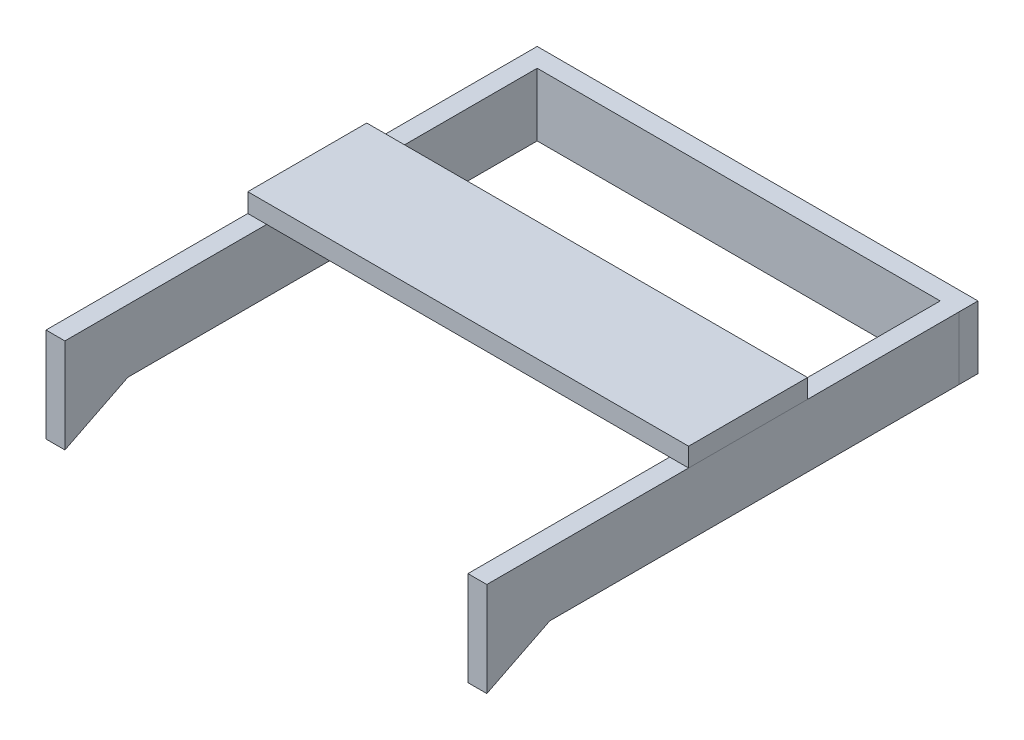
ISO-10303-21;
HEADER;
FILE_DESCRIPTION(('STEP AP214'),'2;1');
FILE_NAME('part.step','',(''),(''),'','','');
FILE_SCHEMA(('AUTOMOTIVE_DESIGN { 1 0 10303 214 1 1 1 1 }'));
ENDSEC;
DATA;
#1=APPLICATION_CONTEXT('core data for automotive mechanical design processes');
#2=APPLICATION_PROTOCOL_DEFINITION('international standard','automotive_design',2000,#1);
#3=PRODUCT_CONTEXT('',#1,'mechanical');
#4=PRODUCT('Part','Part','',(#3));
#5=PRODUCT_RELATED_PRODUCT_CATEGORY('part','',(#4));
#6=PRODUCT_DEFINITION_FORMATION('','',#4);
#7=PRODUCT_DEFINITION_CONTEXT('part definition',#1,'design');
#8=PRODUCT_DEFINITION('design','',#6,#7);
#9=PRODUCT_DEFINITION_SHAPE('','',#8);
#10=(LENGTH_UNIT() NAMED_UNIT(*) SI_UNIT(.MILLI.,.METRE.));
#11=(NAMED_UNIT(*) PLANE_ANGLE_UNIT() SI_UNIT($,.RADIAN.));
#12=(NAMED_UNIT(*) SI_UNIT($,.STERADIAN.) SOLID_ANGLE_UNIT());
#13=UNCERTAINTY_MEASURE_WITH_UNIT(LENGTH_MEASURE(1.E-05),#10,'distance_accuracy_value','');
#14=(GEOMETRIC_REPRESENTATION_CONTEXT(3) GLOBAL_UNCERTAINTY_ASSIGNED_CONTEXT((#13)) GLOBAL_UNIT_ASSIGNED_CONTEXT((#10,
#11,#12)) REPRESENTATION_CONTEXT('',''));
#15=CARTESIAN_POINT('',(0.,0.,0.));
#16=DIRECTION('',(0.,0.,1.));
#17=DIRECTION('',(1.,0.,0.));
#18=AXIS2_PLACEMENT_3D('',#15,#16,#17);
#19=CARTESIAN_POINT('',(118.092027959737,-25.8134335397992,3.));
#20=DIRECTION('',(-1.,0.,0.));
#21=DIRECTION('',(0.,0.,1.));
#22=AXIS2_PLACEMENT_3D('',#19,#20,#21);
#23=PLANE('',#22);
#24=DIRECTION('',(0.,1.,0.));
#25=VECTOR('',#24,1.);
#26=CARTESIAN_POINT('',(118.092027959737,-25.8134335397992,3.));
#27=LINE('',#26,#25);
#28=CARTESIAN_POINT('',(118.092027959737,-35.8134335397992,3.));
#29=VERTEX_POINT('',#28);
#30=CARTESIAN_POINT('',(118.092027959737,-25.8134335397992,3.));
#31=VERTEX_POINT('',#30);
#32=EDGE_CURVE('E11',#29,#31,#27,.T.);
#33=ORIENTED_EDGE('',*,*,#32,.F.);
#34=DIRECTION('',(0.,0.,-1.));
#35=VECTOR('',#34,1.);
#36=CARTESIAN_POINT('',(118.092027959737,-35.8134335397992,3.));
#37=LINE('',#36,#35);
#38=CARTESIAN_POINT('',(118.092027959737,-35.8134335397992,0.));
#39=VERTEX_POINT('',#38);
#40=EDGE_CURVE('E219',#29,#39,#37,.T.);
#41=ORIENTED_EDGE('',*,*,#40,.T.);
#42=DIRECTION('',(0.,1.,0.));
#43=VECTOR('',#42,1.);
#44=CARTESIAN_POINT('',(118.092027959737,-25.8134335397992,0.));
#45=LINE('',#44,#43);
#46=CARTESIAN_POINT('',(118.092027959737,-25.8134335397992,0.));
#47=VERTEX_POINT('',#46);
#48=EDGE_CURVE('E268',#39,#47,#45,.T.);
#49=ORIENTED_EDGE('',*,*,#48,.T.);
#50=DIRECTION('',(0.,0.,-1.));
#51=VECTOR('',#50,1.);
#52=CARTESIAN_POINT('',(118.092027959737,-25.8134335397992,3.));
#53=LINE('',#52,#51);
#54=EDGE_CURVE('E276',#31,#47,#53,.T.);
#55=ORIENTED_EDGE('',*,*,#54,.F.);
#56=EDGE_LOOP('',(#33,#41,#49,#55));
#57=FACE_BOUND('',#56,.T.);
#58=ADVANCED_FACE('F39',(#57),#23,.F.);
#59=DIRECTION('',(0.,0.,1.));
#60=VECTOR('',#59,1.);
#61=CARTESIAN_POINT('',(118.092027959737,-25.8134335397992,3.));
#62=LINE('',#61,#60);
#63=CARTESIAN_POINT('',(118.092027959737,-25.8134335397992,27.0654812157998));
#64=VERTEX_POINT('',#63);
#65=CARTESIAN_POINT('',(118.092027959737,-25.8134335397992,45.9575753429391));
#66=VERTEX_POINT('',#65);
#67=EDGE_CURVE('E43',#64,#66,#62,.T.);
#68=ORIENTED_EDGE('',*,*,#67,.F.);
#69=DIRECTION('',(0.,-1.,0.));
#70=VECTOR('',#69,1.);
#71=CARTESIAN_POINT('',(118.092027959737,-22.8134335397992,27.0654812157998));
#72=LINE('',#71,#70);
#73=CARTESIAN_POINT('',(118.092027959737,-22.8134335397992,27.0654812157998));
#74=VERTEX_POINT('',#73);
#75=EDGE_CURVE('E167',#74,#64,#72,.T.);
#76=ORIENTED_EDGE('',*,*,#75,.F.);
#77=DIRECTION('',(0.,0.,-1.));
#78=VECTOR('',#77,1.);
#79=CARTESIAN_POINT('',(118.092027959737,-22.8134335397992,27.0654812157998));
#80=LINE('',#79,#78);
#81=CARTESIAN_POINT('',(118.092027959737,-22.8134335397992,45.9575753429391));
#82=VERTEX_POINT('',#81);
#83=EDGE_CURVE('E174',#82,#74,#80,.T.);
#84=ORIENTED_EDGE('',*,*,#83,.F.);
#85=DIRECTION('',(0.,-1.,0.));
#86=VECTOR('',#85,1.);
#87=CARTESIAN_POINT('',(118.092027959737,-22.8134335397992,45.9575753429391));
#88=LINE('',#87,#86);
#89=EDGE_CURVE('E313',#82,#66,#88,.T.);
#90=ORIENTED_EDGE('',*,*,#89,.T.);
#91=EDGE_LOOP('',(#68,#76,#84,#90));
#92=FACE_BOUND('',#91,.T.);
#93=ADVANCED_FACE('F185',(#92),#23,.F.);
#94=CARTESIAN_POINT('',(48.0920279597369,-25.8134335397992,3.));
#95=DIRECTION('',(1.,0.,0.));
#96=DIRECTION('',(0.,0.,-1.));
#97=AXIS2_PLACEMENT_3D('',#94,#95,#96);
#98=PLANE('',#97);
#99=DIRECTION('',(0.,-1.,0.));
#100=VECTOR('',#99,1.);
#101=CARTESIAN_POINT('',(48.0920279597369,-25.8134335397992,3.));
#102=LINE('',#101,#100);
#103=CARTESIAN_POINT('',(48.0920279597369,-25.8134335397992,3.));
#104=VERTEX_POINT('',#103);
#105=CARTESIAN_POINT('',(48.0920279597369,-35.8134335397992,3.));
#106=VERTEX_POINT('',#105);
#107=EDGE_CURVE('E289',#104,#106,#102,.T.);
#108=ORIENTED_EDGE('',*,*,#107,.F.);
#109=DIRECTION('',(0.,0.,-1.));
#110=VECTOR('',#109,1.);
#111=CARTESIAN_POINT('',(48.0920279597369,-25.8134335397992,3.));
#112=LINE('',#111,#110);
#113=CARTESIAN_POINT('',(48.0920279597369,-25.8134335397992,0.));
#114=VERTEX_POINT('',#113);
#115=EDGE_CURVE('E264',#104,#114,#112,.T.);
#116=ORIENTED_EDGE('',*,*,#115,.T.);
#117=DIRECTION('',(0.,-1.,0.));
#118=VECTOR('',#117,1.);
#119=CARTESIAN_POINT('',(48.0920279597369,-25.8134335397992,0.));
#120=LINE('',#119,#118);
#121=CARTESIAN_POINT('',(48.0920279597369,-35.8134335397992,0.));
#122=VERTEX_POINT('',#121);
#123=EDGE_CURVE('E259',#114,#122,#120,.T.);
#124=ORIENTED_EDGE('',*,*,#123,.T.);
#125=DIRECTION('',(0.,0.,-1.));
#126=VECTOR('',#125,1.);
#127=CARTESIAN_POINT('',(48.0920279597369,-35.8134335397992,0.));
#128=LINE('',#127,#126);
#129=EDGE_CURVE('E190',#106,#122,#128,.T.);
#130=ORIENTED_EDGE('',*,*,#129,.F.);
#131=EDGE_LOOP('',(#108,#116,#124,#130));
#132=FACE_BOUND('',#131,.T.);
#133=ADVANCED_FACE('F375',(#132),#98,.F.);
#134=DIRECTION('',(0.,0.,-1.));
#135=VECTOR('',#134,1.);
#136=CARTESIAN_POINT('',(48.0920279597369,-25.8134335397992,3.));
#137=LINE('',#136,#135);
#138=CARTESIAN_POINT('',(48.0920279597369,-25.8134335397992,45.9575753429391));
#139=VERTEX_POINT('',#138);
#140=CARTESIAN_POINT('',(48.0920279597369,-25.8134335397992,27.0654812157998));
#141=VERTEX_POINT('',#140);
#142=EDGE_CURVE('E286',#139,#141,#137,.T.);
#143=ORIENTED_EDGE('',*,*,#142,.F.);
#144=DIRECTION('',(0.,-1.,0.));
#145=VECTOR('',#144,1.);
#146=CARTESIAN_POINT('',(48.0920279597369,-22.8134335397992,45.9575753429391));
#147=LINE('',#146,#145);
#148=CARTESIAN_POINT('',(48.0920279597369,-22.8134335397992,45.9575753429391));
#149=VERTEX_POINT('',#148);
#150=EDGE_CURVE('E192',#149,#139,#147,.T.);
#151=ORIENTED_EDGE('',*,*,#150,.F.);
#152=DIRECTION('',(0.,0.,1.));
#153=VECTOR('',#152,1.);
#154=CARTESIAN_POINT('',(48.0920279597369,-22.8134335397992,27.0654812157998));
#155=LINE('',#154,#153);
#156=CARTESIAN_POINT('',(48.0920279597369,-22.8134335397992,27.0654812157998));
#157=VERTEX_POINT('',#156);
#158=EDGE_CURVE('E173',#157,#149,#155,.T.);
#159=ORIENTED_EDGE('',*,*,#158,.F.);
#160=DIRECTION('',(0.,-1.,0.));
#161=VECTOR('',#160,1.);
#162=CARTESIAN_POINT('',(48.0920279597369,-22.8134335397992,27.0654812157998));
#163=LINE('',#162,#161);
#164=EDGE_CURVE('E170',#157,#141,#163,.T.);
#165=ORIENTED_EDGE('',*,*,#164,.T.);
#166=EDGE_LOOP('',(#143,#151,#159,#165));
#167=FACE_BOUND('',#166,.T.);
#168=ADVANCED_FACE('F326',(#167),#98,.F.);
#169=CARTESIAN_POINT('',(48.0920279597369,-25.8134335397992,3.));
#170=DIRECTION('',(0.,-1.,0.));
#171=DIRECTION('',(0.,0.,-1.));
#172=AXIS2_PLACEMENT_3D('',#169,#170,#171);
#173=PLANE('',#172);
#174=DIRECTION('',(1.,0.,0.));
#175=VECTOR('',#174,1.);
#176=CARTESIAN_POINT('',(118.092027959737,-25.8134335397992,45.9575753429391));
#177=LINE('',#176,#175);
#178=CARTESIAN_POINT('',(51.0920279597369,-25.8134335397992,45.9575753429391));
#179=VERTEX_POINT('',#178);
#180=EDGE_CURVE('E183',#139,#179,#177,.T.);
#181=ORIENTED_EDGE('',*,*,#180,.F.);
#182=CARTESIAN_POINT('',(48.0920279597369,-25.8134335397992,78.));
#183=VERTEX_POINT('',#182);
#184=EDGE_CURVE('E273',#183,#139,#112,.T.);
#185=ORIENTED_EDGE('',*,*,#184,.F.);
#186=DIRECTION('',(-1.,0.,0.));
#187=VECTOR('',#186,1.);
#188=CARTESIAN_POINT('',(48.0920279597369,-25.8134335397992,78.));
#189=LINE('',#188,#187);
#190=CARTESIAN_POINT('',(51.0920279597369,-25.8134335397992,78.));
#191=VERTEX_POINT('',#190);
#192=EDGE_CURVE('E250',#191,#183,#189,.T.);
#193=ORIENTED_EDGE('',*,*,#192,.F.);
#194=DIRECTION('',(0.,0.,-1.));
#195=VECTOR('',#194,1.);
#196=CARTESIAN_POINT('',(51.0920279597369,-25.8134335397992,78.));
#197=LINE('',#196,#195);
#198=EDGE_CURVE('E256',#191,#179,#197,.T.);
#199=ORIENTED_EDGE('',*,*,#198,.T.);
#200=EDGE_LOOP('',(#181,#185,#193,#199));
#201=FACE_BOUND('',#200,.T.);
#202=ADVANCED_FACE('F329',(#201),#173,.F.);
#203=CARTESIAN_POINT('',(115.092027959737,-25.8134335397992,45.9575753429391));
#204=VERTEX_POINT('',#203);
#205=EDGE_CURVE('E290',#204,#66,#177,.T.);
#206=ORIENTED_EDGE('',*,*,#205,.F.);
#207=DIRECTION('',(0.,0.,-1.));
#208=VECTOR('',#207,1.);
#209=CARTESIAN_POINT('',(115.092027959737,-25.8134335397992,78.));
#210=LINE('',#209,#208);
#211=CARTESIAN_POINT('',(115.092027959737,-25.8134335397992,78.));
#212=VERTEX_POINT('',#211);
#213=EDGE_CURVE('E223',#212,#204,#210,.T.);
#214=ORIENTED_EDGE('',*,*,#213,.F.);
#215=DIRECTION('',(-1.,0.,0.));
#216=VECTOR('',#215,1.);
#217=CARTESIAN_POINT('',(118.092027959737,-25.8134335397992,78.));
#218=LINE('',#217,#216);
#219=CARTESIAN_POINT('',(118.092027959737,-25.8134335397992,78.));
#220=VERTEX_POINT('',#219);
#221=EDGE_CURVE('E238',#220,#212,#218,.T.);
#222=ORIENTED_EDGE('',*,*,#221,.F.);
#223=EDGE_CURVE('E278',#220,#66,#53,.T.);
#224=ORIENTED_EDGE('',*,*,#223,.T.);
#225=EDGE_LOOP('',(#206,#214,#222,#224));
#226=FACE_BOUND('',#225,.T.);
#227=ADVANCED_FACE('F307',(#226),#173,.F.);
#228=DIRECTION('',(-1.,0.,0.));
#229=VECTOR('',#228,1.);
#230=CARTESIAN_POINT('',(118.092027959737,-25.8134335397992,27.0654812157998));
#231=LINE('',#230,#229);
#232=CARTESIAN_POINT('',(115.092027959737,-25.8134335397992,27.0654812157998));
#233=VERTEX_POINT('',#232);
#234=EDGE_CURVE('E321',#64,#233,#231,.T.);
#235=ORIENTED_EDGE('',*,*,#234,.F.);
#236=EDGE_CURVE('E282',#64,#31,#53,.T.);
#237=ORIENTED_EDGE('',*,*,#236,.T.);
#238=ORIENTED_EDGE('',*,*,#54,.T.);
#239=DIRECTION('',(-1.,0.,0.));
#240=VECTOR('',#239,1.);
#241=CARTESIAN_POINT('',(48.0920279597369,-25.8134335397992,0.));
#242=LINE('',#241,#240);
#243=EDGE_CURVE('E265',#47,#114,#242,.T.);
#244=ORIENTED_EDGE('',*,*,#243,.T.);
#245=ORIENTED_EDGE('',*,*,#115,.F.);
#246=EDGE_CURVE('E277',#141,#104,#112,.T.);
#247=ORIENTED_EDGE('',*,*,#246,.F.);
#248=CARTESIAN_POINT('',(51.0920279597369,-25.8134335397992,27.0654812157998));
#249=VERTEX_POINT('',#248);
#250=EDGE_CURVE('E285',#249,#141,#231,.T.);
#251=ORIENTED_EDGE('',*,*,#250,.F.);
#252=CARTESIAN_POINT('',(51.0920279597369,-25.8134335397992,3.));
#253=VERTEX_POINT('',#252);
#254=EDGE_CURVE('E253',#249,#253,#197,.T.);
#255=ORIENTED_EDGE('',*,*,#254,.T.);
#256=DIRECTION('',(-1.,0.,0.));
#257=VECTOR('',#256,1.);
#258=CARTESIAN_POINT('',(48.0920279597369,-25.8134335397992,3.));
#259=LINE('',#258,#257);
#260=CARTESIAN_POINT('',(115.092027959737,-25.8134335397992,3.));
#261=VERTEX_POINT('',#260);
#262=EDGE_CURVE('E261',#261,#253,#259,.T.);
#263=ORIENTED_EDGE('',*,*,#262,.F.);
#264=EDGE_CURVE('E222',#233,#261,#210,.T.);
#265=ORIENTED_EDGE('',*,*,#264,.F.);
#266=EDGE_LOOP('',(#235,#237,#238,#244,#245,#247,#251,#255,#263,#265));
#267=FACE_BOUND('',#266,.T.);
#268=ADVANCED_FACE('F347',(#267),#173,.F.);
#269=CARTESIAN_POINT('',(0.,0.,3.));
#270=DIRECTION('',(0.,0.,1.));
#271=DIRECTION('',(1.,0.,0.));
#272=AXIS2_PLACEMENT_3D('',#269,#270,#271);
#273=PLANE('',#272);
#274=DIRECTION('',(-1.,0.,0.));
#275=VECTOR('',#274,1.);
#276=CARTESIAN_POINT('',(0.,-35.8134335397992,3.));
#277=LINE('',#276,#275);
#278=CARTESIAN_POINT('',(115.092027959737,-35.8134335397992,3.));
#279=VERTEX_POINT('',#278);
#280=CARTESIAN_POINT('',(51.0920279597369,-35.8134335397992,3.));
#281=VERTEX_POINT('',#280);
#282=EDGE_CURVE('E214',#279,#281,#277,.T.);
#283=ORIENTED_EDGE('',*,*,#282,.F.);
#284=DIRECTION('',(0.,-1.,0.));
#285=VECTOR('',#284,1.);
#286=CARTESIAN_POINT('',(115.092027959737,-25.8134335397992,3.));
#287=LINE('',#286,#285);
#288=EDGE_CURVE('E228',#261,#279,#287,.T.);
#289=ORIENTED_EDGE('',*,*,#288,.F.);
#290=ORIENTED_EDGE('',*,*,#262,.T.);
#291=DIRECTION('',(0.,1.,0.));
#292=VECTOR('',#291,1.);
#293=CARTESIAN_POINT('',(51.0920279597369,-25.8134335397992,3.));
#294=LINE('',#293,#292);
#295=EDGE_CURVE('E231',#281,#253,#294,.T.);
#296=ORIENTED_EDGE('',*,*,#295,.F.);
#297=EDGE_LOOP('',(#283,#289,#290,#296));
#298=FACE_BOUND('',#297,.T.);
#299=ADVANCED_FACE('F353',(#298),#273,.T.);
#300=ORIENTED_EDGE('',*,*,#246,.T.);
#301=ORIENTED_EDGE('',*,*,#107,.T.);
#302=CARTESIAN_POINT('',(48.0920279597369,-35.8134335397992,68.));
#303=VERTEX_POINT('',#302);
#304=EDGE_CURVE('E196',#303,#106,#128,.T.);
#305=ORIENTED_EDGE('',*,*,#304,.F.);
#306=DIRECTION('',(0.,0.447213595499959,-0.894427190999915));
#307=VECTOR('',#306,1.);
#308=CARTESIAN_POINT('',(48.0920279597369,-1.4507468318392,-0.725373415919605));
#309=LINE('',#308,#307);
#310=CARTESIAN_POINT('',(48.0920279597369,-40.8134335397992,78.));
#311=VERTEX_POINT('',#310);
#312=EDGE_CURVE('E187',#311,#303,#309,.T.);
#313=ORIENTED_EDGE('',*,*,#312,.F.);
#314=DIRECTION('',(0.,-1.,0.));
#315=VECTOR('',#314,1.);
#316=CARTESIAN_POINT('',(48.0920279597369,-25.8134335397992,78.));
#317=LINE('',#316,#315);
#318=EDGE_CURVE('E242',#183,#311,#317,.T.);
#319=ORIENTED_EDGE('',*,*,#318,.F.);
#320=ORIENTED_EDGE('',*,*,#184,.T.);
#321=ORIENTED_EDGE('',*,*,#142,.T.);
#322=EDGE_LOOP('',(#300,#301,#305,#313,#319,#320,#321));
#323=FACE_BOUND('',#322,.T.);
#324=ADVANCED_FACE('F41',(#323),#98,.F.);
#325=CARTESIAN_POINT('',(118.092027959737,-35.8134335397992,68.));
#326=VERTEX_POINT('',#325);
#327=EDGE_CURVE('E220',#326,#29,#37,.T.);
#328=ORIENTED_EDGE('',*,*,#327,.T.);
#329=ORIENTED_EDGE('',*,*,#32,.T.);
#330=ORIENTED_EDGE('',*,*,#236,.F.);
#331=ORIENTED_EDGE('',*,*,#67,.T.);
#332=ORIENTED_EDGE('',*,*,#223,.F.);
#333=DIRECTION('',(0.,1.,0.));
#334=VECTOR('',#333,1.);
#335=CARTESIAN_POINT('',(118.092027959737,-25.8134335397992,78.));
#336=LINE('',#335,#334);
#337=CARTESIAN_POINT('',(118.092027959737,-40.8134335397992,78.));
#338=VERTEX_POINT('',#337);
#339=EDGE_CURVE('E232',#338,#220,#336,.T.);
#340=ORIENTED_EDGE('',*,*,#339,.F.);
#341=DIRECTION('',(0.,0.447213595499959,-0.894427190999915));
#342=VECTOR('',#341,1.);
#343=CARTESIAN_POINT('',(118.092027959737,-7.81343353979907,12.0000000000001));
#344=LINE('',#343,#342);
#345=EDGE_CURVE('E211',#338,#326,#344,.T.);
#346=ORIENTED_EDGE('',*,*,#345,.T.);
#347=EDGE_LOOP('',(#328,#329,#330,#331,#332,#340,#346));
#348=FACE_BOUND('',#347,.T.);
#349=ADVANCED_FACE('F301',(#348),#23,.F.);
#350=CARTESIAN_POINT('',(0.,0.,0.));
#351=DIRECTION('',(0.,0.,1.));
#352=DIRECTION('',(1.,0.,0.));
#353=AXIS2_PLACEMENT_3D('',#350,#351,#352);
#354=PLANE('',#353);
#355=ORIENTED_EDGE('',*,*,#48,.F.);
#356=DIRECTION('',(-1.,0.,0.));
#357=VECTOR('',#356,1.);
#358=CARTESIAN_POINT('',(123.092027959737,-35.8134335397992,0.));
#359=LINE('',#358,#357);
#360=EDGE_CURVE('E200',#39,#122,#359,.T.);
#361=ORIENTED_EDGE('',*,*,#360,.T.);
#362=ORIENTED_EDGE('',*,*,#123,.F.);
#363=ORIENTED_EDGE('',*,*,#243,.F.);
#364=EDGE_LOOP('',(#355,#361,#362,#363));
#365=FACE_BOUND('',#364,.T.);
#366=ADVANCED_FACE('F378',(#365),#354,.F.);
#367=CARTESIAN_POINT('',(51.0920279597369,-25.8134335397992,78.));
#368=DIRECTION('',(-1.,0.,0.));
#369=DIRECTION('',(0.,0.,1.));
#370=AXIS2_PLACEMENT_3D('',#367,#368,#369);
#371=PLANE('',#370);
#372=DIRECTION('',(0.,1.,0.));
#373=VECTOR('',#372,1.);
#374=CARTESIAN_POINT('',(51.0920279597369,-25.8134335397992,78.));
#375=LINE('',#374,#373);
#376=CARTESIAN_POINT('',(51.0920279597369,-40.8134335397992,78.));
#377=VERTEX_POINT('',#376);
#378=EDGE_CURVE('E248',#377,#191,#375,.T.);
#379=ORIENTED_EDGE('',*,*,#378,.F.);
#380=DIRECTION('',(0.,0.447213595499959,-0.894427190999915));
#381=VECTOR('',#380,1.);
#382=CARTESIAN_POINT('',(51.0920279597369,-37.8134335397992,72.));
#383=LINE('',#382,#381);
#384=CARTESIAN_POINT('',(51.0920279597369,-35.8134335397992,68.));
#385=VERTEX_POINT('',#384);
#386=EDGE_CURVE('E208',#377,#385,#383,.T.);
#387=ORIENTED_EDGE('',*,*,#386,.T.);
#388=DIRECTION('',(0.,0.,-1.));
#389=VECTOR('',#388,1.);
#390=CARTESIAN_POINT('',(51.0920279597369,-35.8134335397992,78.));
#391=LINE('',#390,#389);
#392=EDGE_CURVE('E216',#385,#281,#391,.T.);
#393=ORIENTED_EDGE('',*,*,#392,.T.);
#394=ORIENTED_EDGE('',*,*,#295,.T.);
#395=ORIENTED_EDGE('',*,*,#254,.F.);
#396=EDGE_CURVE('E260',#179,#249,#197,.T.);
#397=ORIENTED_EDGE('',*,*,#396,.F.);
#398=ORIENTED_EDGE('',*,*,#198,.F.);
#399=EDGE_LOOP('',(#379,#387,#393,#394,#395,#397,#398));
#400=FACE_BOUND('',#399,.T.);
#401=ADVANCED_FACE('F339',(#400),#371,.F.);
#402=CARTESIAN_POINT('',(0.,0.,78.));
#403=DIRECTION('',(0.,0.,1.));
#404=DIRECTION('',(1.,0.,0.));
#405=AXIS2_PLACEMENT_3D('',#402,#403,#404);
#406=PLANE('',#405);
#407=ORIENTED_EDGE('',*,*,#318,.T.);
#408=DIRECTION('',(1.,0.,0.));
#409=VECTOR('',#408,1.);
#410=CARTESIAN_POINT('',(48.0920279597369,-40.8134335397992,78.));
#411=LINE('',#410,#409);
#412=EDGE_CURVE('E245',#311,#377,#411,.T.);
#413=ORIENTED_EDGE('',*,*,#412,.T.);
#414=ORIENTED_EDGE('',*,*,#378,.T.);
#415=ORIENTED_EDGE('',*,*,#192,.T.);
#416=EDGE_LOOP('',(#407,#413,#414,#415));
#417=FACE_BOUND('',#416,.T.);
#418=ADVANCED_FACE('F336',(#417),#406,.T.);
#419=CARTESIAN_POINT('',(115.092027959737,-25.8134335397992,78.));
#420=DIRECTION('',(1.,0.,0.));
#421=DIRECTION('',(0.,0.,-1.));
#422=AXIS2_PLACEMENT_3D('',#419,#420,#421);
#423=PLANE('',#422);
#424=DIRECTION('',(0.,0.,1.));
#425=VECTOR('',#424,1.);
#426=CARTESIAN_POINT('',(115.092027959737,-35.8134335397992,78.));
#427=LINE('',#426,#425);
#428=CARTESIAN_POINT('',(115.092027959737,-35.8134335397992,68.));
#429=VERTEX_POINT('',#428);
#430=EDGE_CURVE('E281',#279,#429,#427,.T.);
#431=ORIENTED_EDGE('',*,*,#430,.T.);
#432=DIRECTION('',(0.,-0.447213595499959,0.894427190999915));
#433=VECTOR('',#432,1.);
#434=CARTESIAN_POINT('',(115.092027959737,-37.8134335397992,72.));
#435=LINE('',#434,#433);
#436=CARTESIAN_POINT('',(115.092027959737,-40.8134335397992,78.));
#437=VERTEX_POINT('',#436);
#438=EDGE_CURVE('E203',#429,#437,#435,.T.);
#439=ORIENTED_EDGE('',*,*,#438,.T.);
#440=DIRECTION('',(0.,-1.,0.));
#441=VECTOR('',#440,1.);
#442=CARTESIAN_POINT('',(115.092027959737,-25.8134335397992,78.));
#443=LINE('',#442,#441);
#444=EDGE_CURVE('E235',#212,#437,#443,.T.);
#445=ORIENTED_EDGE('',*,*,#444,.F.);
#446=ORIENTED_EDGE('',*,*,#213,.T.);
#447=EDGE_CURVE('E227',#204,#233,#210,.T.);
#448=ORIENTED_EDGE('',*,*,#447,.T.);
#449=ORIENTED_EDGE('',*,*,#264,.T.);
#450=ORIENTED_EDGE('',*,*,#288,.T.);
#451=EDGE_LOOP('',(#431,#439,#445,#446,#448,#449,#450));
#452=FACE_BOUND('',#451,.T.);
#453=ADVANCED_FACE('F355',(#452),#423,.F.);
#454=CARTESIAN_POINT('',(0.,0.,78.));
#455=DIRECTION('',(0.,0.,-1.));
#456=DIRECTION('',(-1.,0.,0.));
#457=AXIS2_PLACEMENT_3D('',#454,#455,#456);
#458=PLANE('',#457);
#459=ORIENTED_EDGE('',*,*,#339,.T.);
#460=ORIENTED_EDGE('',*,*,#221,.T.);
#461=ORIENTED_EDGE('',*,*,#444,.T.);
#462=DIRECTION('',(1.,0.,0.));
#463=VECTOR('',#462,1.);
#464=CARTESIAN_POINT('',(118.092027959737,-40.8134335397992,78.));
#465=LINE('',#464,#463);
#466=EDGE_CURVE('E226',#437,#338,#465,.T.);
#467=ORIENTED_EDGE('',*,*,#466,.T.);
#468=EDGE_LOOP('',(#459,#460,#461,#467));
#469=FACE_BOUND('',#468,.T.);
#470=ADVANCED_FACE('F433',(#469),#458,.F.);
#471=CARTESIAN_POINT('',(123.092027959737,-35.8134335397992,0.));
#472=DIRECTION('',(0.,1.,0.));
#473=DIRECTION('',(0.,0.,1.));
#474=AXIS2_PLACEMENT_3D('',#471,#472,#473);
#475=PLANE('',#474);
#476=DIRECTION('',(-1.,0.,0.));
#477=VECTOR('',#476,1.);
#478=CARTESIAN_POINT('',(123.092027959737,-35.8134335397992,68.));
#479=LINE('',#478,#477);
#480=EDGE_CURVE('E204',#326,#429,#479,.T.);
#481=ORIENTED_EDGE('',*,*,#480,.T.);
#482=ORIENTED_EDGE('',*,*,#430,.F.);
#483=ORIENTED_EDGE('',*,*,#282,.T.);
#484=ORIENTED_EDGE('',*,*,#392,.F.);
#485=EDGE_CURVE('E199',#385,#303,#479,.T.);
#486=ORIENTED_EDGE('',*,*,#485,.T.);
#487=ORIENTED_EDGE('',*,*,#304,.T.);
#488=ORIENTED_EDGE('',*,*,#129,.T.);
#489=ORIENTED_EDGE('',*,*,#360,.F.);
#490=ORIENTED_EDGE('',*,*,#40,.F.);
#491=ORIENTED_EDGE('',*,*,#327,.F.);
#492=EDGE_LOOP('',(#481,#482,#483,#484,#486,#487,#488,#489,#490,#491));
#493=FACE_BOUND('',#492,.T.);
#494=ADVANCED_FACE('F438',(#493),#475,.F.);
#495=CARTESIAN_POINT('',(123.092027959737,-1.4507468318392,-0.725373415919605));
#496=DIRECTION('',(0.,0.894427190999915,0.447213595499959));
#497=DIRECTION('',(0.,-0.447213595499959,0.894427190999915));
#498=AXIS2_PLACEMENT_3D('',#495,#496,#497);
#499=PLANE('',#498);
#500=ORIENTED_EDGE('',*,*,#466,.F.);
#501=ORIENTED_EDGE('',*,*,#438,.F.);
#502=ORIENTED_EDGE('',*,*,#480,.F.);
#503=ORIENTED_EDGE('',*,*,#345,.F.);
#504=EDGE_LOOP('',(#500,#501,#502,#503));
#505=FACE_BOUND('',#504,.T.);
#506=ADVANCED_FACE('F366',(#505),#499,.F.);
#507=ORIENTED_EDGE('',*,*,#412,.F.);
#508=ORIENTED_EDGE('',*,*,#312,.T.);
#509=ORIENTED_EDGE('',*,*,#485,.F.);
#510=ORIENTED_EDGE('',*,*,#386,.F.);
#511=EDGE_LOOP('',(#507,#508,#509,#510));
#512=FACE_BOUND('',#511,.T.);
#513=ADVANCED_FACE('F359',(#512),#499,.F.);
#514=CARTESIAN_POINT('',(0.,-25.8134335397992,0.));
#515=DIRECTION('',(0.,-1.,0.));
#516=DIRECTION('',(0.,0.,-1.));
#517=AXIS2_PLACEMENT_3D('',#514,#515,#516);
#518=PLANE('',#517);
#519=EDGE_CURVE('E315',#179,#204,#177,.T.);
#520=ORIENTED_EDGE('',*,*,#519,.F.);
#521=ORIENTED_EDGE('',*,*,#396,.T.);
#522=EDGE_CURVE('E322',#233,#249,#231,.T.);
#523=ORIENTED_EDGE('',*,*,#522,.F.);
#524=ORIENTED_EDGE('',*,*,#447,.F.);
#525=EDGE_LOOP('',(#520,#521,#523,#524));
#526=FACE_BOUND('',#525,.T.);
#527=ADVANCED_FACE('F357',(#526),#518,.T.);
#528=CARTESIAN_POINT('',(118.092027959737,-22.8134335397992,27.0654812157998));
#529=DIRECTION('',(0.,0.,1.));
#530=DIRECTION('',(1.,0.,0.));
#531=AXIS2_PLACEMENT_3D('',#528,#529,#530);
#532=PLANE('',#531);
#533=ORIENTED_EDGE('',*,*,#234,.T.);
#534=ORIENTED_EDGE('',*,*,#522,.T.);
#535=ORIENTED_EDGE('',*,*,#250,.T.);
#536=ORIENTED_EDGE('',*,*,#164,.F.);
#537=DIRECTION('',(-1.,0.,0.));
#538=VECTOR('',#537,1.);
#539=CARTESIAN_POINT('',(118.092027959737,-22.8134335397992,27.0654812157998));
#540=LINE('',#539,#538);
#541=EDGE_CURVE('E162',#74,#157,#540,.T.);
#542=ORIENTED_EDGE('',*,*,#541,.F.);
#543=ORIENTED_EDGE('',*,*,#75,.T.);
#544=EDGE_LOOP('',(#533,#534,#535,#536,#542,#543));
#545=FACE_BOUND('',#544,.T.);
#546=ADVANCED_FACE('F165',(#545),#532,.F.);
#547=CARTESIAN_POINT('',(118.092027959737,-22.8134335397992,45.9575753429391));
#548=DIRECTION('',(0.,0.,-1.));
#549=DIRECTION('',(-1.,0.,0.));
#550=AXIS2_PLACEMENT_3D('',#547,#548,#549);
#551=PLANE('',#550);
#552=ORIENTED_EDGE('',*,*,#180,.T.);
#553=ORIENTED_EDGE('',*,*,#519,.T.);
#554=ORIENTED_EDGE('',*,*,#205,.T.);
#555=ORIENTED_EDGE('',*,*,#89,.F.);
#556=DIRECTION('',(1.,0.,0.));
#557=VECTOR('',#556,1.);
#558=CARTESIAN_POINT('',(118.092027959737,-22.8134335397992,45.9575753429391));
#559=LINE('',#558,#557);
#560=EDGE_CURVE('E179',#149,#82,#559,.T.);
#561=ORIENTED_EDGE('',*,*,#560,.F.);
#562=ORIENTED_EDGE('',*,*,#150,.T.);
#563=EDGE_LOOP('',(#552,#553,#554,#555,#561,#562));
#564=FACE_BOUND('',#563,.T.);
#565=ADVANCED_FACE('F312',(#564),#551,.F.);
#566=CARTESIAN_POINT('',(0.,-22.8134335397992,0.));
#567=DIRECTION('',(0.,-1.,0.));
#568=DIRECTION('',(0.,0.,-1.));
#569=AXIS2_PLACEMENT_3D('',#566,#567,#568);
#570=PLANE('',#569);
#571=ORIENTED_EDGE('',*,*,#83,.T.);
#572=ORIENTED_EDGE('',*,*,#541,.T.);
#573=ORIENTED_EDGE('',*,*,#158,.T.);
#574=ORIENTED_EDGE('',*,*,#560,.T.);
#575=EDGE_LOOP('',(#571,#572,#573,#574));
#576=FACE_BOUND('',#575,.T.);
#577=ADVANCED_FACE('F177',(#576),#570,.F.);
#578=CLOSED_SHELL('',(#58,#93,#133,#168,#202,#227,#268,#299,#324,#349,#366,#401,#418,#453,#470,
#494,#506,#513,#527,#546,#565,#577));
#579=MANIFOLD_SOLID_BREP('B2',#578);
#580=ADVANCED_BREP_SHAPE_REPRESENTATION('',(#18,#579),#14);
#581=SHAPE_DEFINITION_REPRESENTATION(#9,#580);
ENDSEC;
END-ISO-10303-21;
